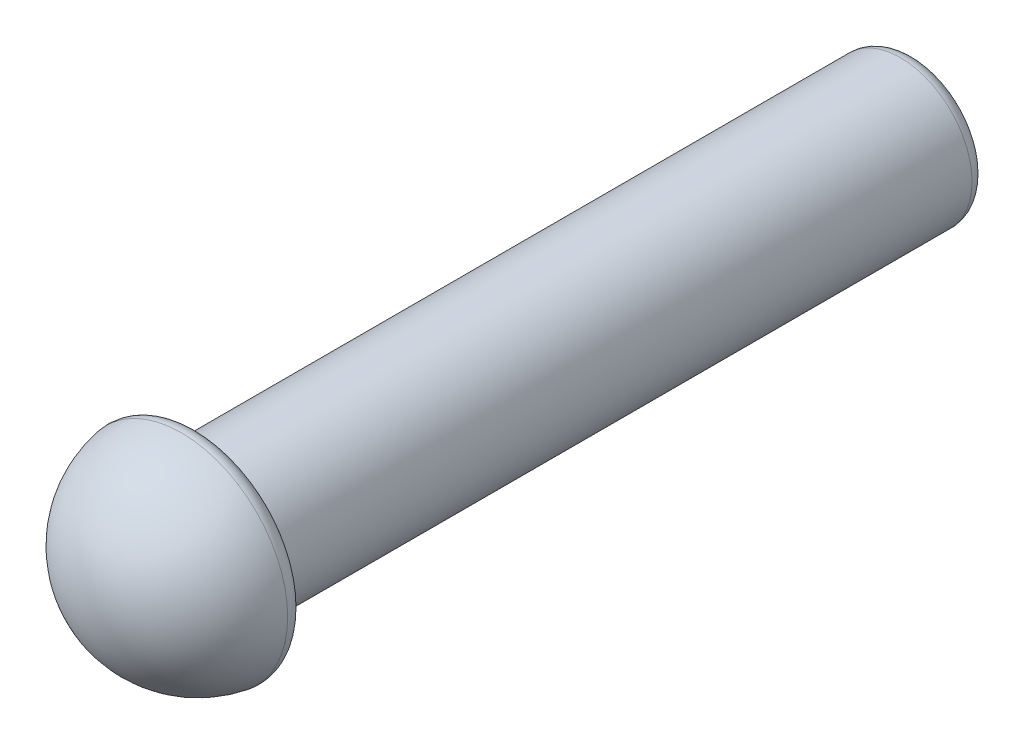
ISO-10303-21;
HEADER;
FILE_DESCRIPTION(('STEP AP214'),'2;1');
FILE_NAME('part.step','',(''),(''),'','','');
FILE_SCHEMA(('AUTOMOTIVE_DESIGN { 1 0 10303 214 1 1 1 1 }'));
ENDSEC;
DATA;
#1=APPLICATION_CONTEXT('core data for automotive mechanical design processes');
#2=APPLICATION_PROTOCOL_DEFINITION('international standard','automotive_design',2000,#1);
#3=PRODUCT_CONTEXT('',#1,'mechanical');
#4=PRODUCT('Part','Part','',(#3));
#5=PRODUCT_RELATED_PRODUCT_CATEGORY('part','',(#4));
#6=PRODUCT_DEFINITION_FORMATION('','',#4);
#7=PRODUCT_DEFINITION_CONTEXT('part definition',#1,'design');
#8=PRODUCT_DEFINITION('design','',#6,#7);
#9=PRODUCT_DEFINITION_SHAPE('','',#8);
#10=(LENGTH_UNIT() NAMED_UNIT(*) SI_UNIT(.MILLI.,.METRE.));
#11=(NAMED_UNIT(*) PLANE_ANGLE_UNIT() SI_UNIT($,.RADIAN.));
#12=(NAMED_UNIT(*) SI_UNIT($,.STERADIAN.) SOLID_ANGLE_UNIT());
#13=UNCERTAINTY_MEASURE_WITH_UNIT(LENGTH_MEASURE(1.E-05),#10,'distance_accuracy_value','');
#14=(GEOMETRIC_REPRESENTATION_CONTEXT(3) GLOBAL_UNCERTAINTY_ASSIGNED_CONTEXT((#13)) GLOBAL_UNIT_ASSIGNED_CONTEXT((#10,
#11,#12)) REPRESENTATION_CONTEXT('',''));
#15=CARTESIAN_POINT('',(0.,0.,0.));
#16=DIRECTION('',(0.,0.,1.));
#17=DIRECTION('',(1.,0.,0.));
#18=AXIS2_PLACEMENT_3D('',#15,#16,#17);
#19=CARTESIAN_POINT('',(0.,0.,-25.4));
#20=DIRECTION('',(0.,0.,1.));
#21=DIRECTION('',(1.,0.,0.));
#22=AXIS2_PLACEMENT_3D('',#19,#20,#21);
#23=PLANE('',#22);
#24=CARTESIAN_POINT('',(0.,0.,-25.4));
#25=DIRECTION('',(0.,0.,1.));
#26=DIRECTION('',(1.,0.,0.));
#27=AXIS2_PLACEMENT_3D('',#24,#25,#26);
#28=CIRCLE('',#27,2.032);
#29=CARTESIAN_POINT('',(2.032,0.,-25.4));
#30=VERTEX_POINT('',#29);
#31=EDGE_CURVE('E55',#30,#30,#28,.F.);
#32=ORIENTED_EDGE('',*,*,#31,.T.);
#33=EDGE_LOOP('',(#32));
#34=FACE_BOUND('',#33,.T.);
#35=ADVANCED_FACE('F37',(#34),#23,.F.);
#36=CARTESIAN_POINT('',(0.,0.,3.30705037148499));
#37=DIRECTION('',(0.,0.,1.));
#38=DIRECTION('',(1.,0.,0.));
#39=AXIS2_PLACEMENT_3D('',#36,#37,#38);
#40=CYLINDRICAL_SURFACE('',#39,2.54);
#41=CARTESIAN_POINT('',(0.,0.,-24.892));
#42=DIRECTION('',(0.,0.,1.));
#43=DIRECTION('',(1.,0.,0.));
#44=AXIS2_PLACEMENT_3D('',#41,#42,#43);
#45=CIRCLE('',#44,2.54);
#46=CARTESIAN_POINT('',(2.54,0.,-24.892));
#47=VERTEX_POINT('',#46);
#48=EDGE_CURVE('E61',#47,#47,#45,.T.);
#49=ORIENTED_EDGE('',*,*,#48,.T.);
#50=EDGE_LOOP('',(#49));
#51=FACE_BOUND('',#50,.T.);
#52=CARTESIAN_POINT('',(0.,0.,-0.507999999999989));
#53=DIRECTION('',(0.,0.,1.));
#54=DIRECTION('',(1.,0.,0.));
#55=AXIS2_PLACEMENT_3D('',#52,#53,#54);
#56=CIRCLE('',#55,2.54);
#57=CARTESIAN_POINT('',(2.54,0.,-0.507999999999989));
#58=VERTEX_POINT('',#57);
#59=EDGE_CURVE('E65',#58,#58,#56,.F.);
#60=ORIENTED_EDGE('',*,*,#59,.T.);
#61=EDGE_LOOP('',(#60));
#62=FACE_BOUND('',#61,.T.);
#63=ADVANCED_FACE('F70',(#51,#62),#40,.T.);
#64=CARTESIAN_POINT('',(0.,2.54,0.));
#65=DIRECTION('',(0.,0.,1.));
#66=DIRECTION('',(1.,0.,0.));
#67=AXIS2_PLACEMENT_3D('',#64,#65,#66);
#68=PLANE('',#67);
#69=CARTESIAN_POINT('',(0.,0.,0.));
#70=DIRECTION('',(0.,0.,1.));
#71=DIRECTION('',(1.,0.,0.));
#72=AXIS2_PLACEMENT_3D('',#69,#70,#71);
#73=CIRCLE('',#72,3.048);
#74=CARTESIAN_POINT('',(3.048,0.,0.));
#75=VERTEX_POINT('',#74);
#76=EDGE_CURVE('E45',#75,#75,#73,.T.);
#77=ORIENTED_EDGE('',*,*,#76,.T.);
#78=EDGE_LOOP('',(#77));
#79=FACE_BOUND('',#78,.T.);
#80=CARTESIAN_POINT('',(0.,0.,0.));
#81=DIRECTION('',(0.,0.,1.));
#82=DIRECTION('',(1.,0.,0.));
#83=AXIS2_PLACEMENT_3D('',#80,#81,#82);
#84=CIRCLE('',#83,3.26268907498094);
#85=CARTESIAN_POINT('',(3.26268907498094,0.,0.));
#86=VERTEX_POINT('',#85);
#87=EDGE_CURVE('E50',#86,#86,#84,.F.);
#88=ORIENTED_EDGE('',*,*,#87,.T.);
#89=EDGE_LOOP('',(#88));
#90=FACE_BOUND('',#89,.T.);
#91=ADVANCED_FACE('F90',(#79,#90),#68,.F.);
#92=CARTESIAN_POINT('',(0.,0.,0.));
#93=DIRECTION('',(0.,0.,1.));
#94=DIRECTION('',(0.,1.,0.));
#95=AXIS2_PLACEMENT_3D('',#92,#93,#94);
#96=SPHERICAL_SURFACE('',#95,3.81);
#97=CARTESIAN_POINT('',(0.,0.,0.586153846153858));
#98=DIRECTION('',(0.,0.,-1.));
#99=DIRECTION('',(-1.,0.,0.));
#100=AXIS2_PLACEMENT_3D('',#97,#98,#99);
#101=CIRCLE('',#100,3.76464124036262);
#102=CARTESIAN_POINT('',(-3.76464124036262,0.,0.586153846153858));
#103=VERTEX_POINT('',#102);
#104=EDGE_CURVE('E10',#103,#103,#101,.F.);
#105=ORIENTED_EDGE('',*,*,#104,.T.);
#106=EDGE_LOOP('',(#105));
#107=FACE_BOUND('',#106,.T.);
#108=ADVANCED_FACE('F81',(#107),#96,.T.);
#109=CARTESIAN_POINT('',(0.,0.,-24.892));
#110=DIRECTION('',(0.,0.,1.));
#111=DIRECTION('',(1.,0.,0.));
#112=AXIS2_PLACEMENT_3D('',#109,#110,#111);
#113=TOROIDAL_SURFACE('',#112,2.032,0.508);
#114=ORIENTED_EDGE('',*,*,#31,.F.);
#115=EDGE_LOOP('',(#114));
#116=FACE_BOUND('',#115,.T.);
#117=ORIENTED_EDGE('',*,*,#48,.F.);
#118=EDGE_LOOP('',(#117));
#119=FACE_BOUND('',#118,.T.);
#120=ADVANCED_FACE('F75',(#116,#119),#113,.T.);
#121=CARTESIAN_POINT('',(0.,0.,-0.507999999999989));
#122=DIRECTION('',(0.,0.,1.));
#123=DIRECTION('',(1.,0.,0.));
#124=AXIS2_PLACEMENT_3D('',#121,#122,#123);
#125=TOROIDAL_SURFACE('',#124,3.048,0.508);
#126=ORIENTED_EDGE('',*,*,#59,.F.);
#127=EDGE_LOOP('',(#126));
#128=FACE_BOUND('',#127,.T.);
#129=ORIENTED_EDGE('',*,*,#76,.F.);
#130=EDGE_LOOP('',(#129));
#131=FACE_BOUND('',#130,.T.);
#132=ADVANCED_FACE('F72',(#128,#131),#125,.F.);
#133=CARTESIAN_POINT('',(0.,0.,0.508000000000011));
#134=DIRECTION('',(0.,0.,1.));
#135=DIRECTION('',(1.,0.,0.));
#136=AXIS2_PLACEMENT_3D('',#133,#134,#135);
#137=TOROIDAL_SURFACE('',#136,3.26268907498094,0.508);
#138=ORIENTED_EDGE('',*,*,#87,.F.);
#139=EDGE_LOOP('',(#138));
#140=FACE_BOUND('',#139,.T.);
#141=ORIENTED_EDGE('',*,*,#104,.F.);
#142=EDGE_LOOP('',(#141));
#143=FACE_BOUND('',#142,.T.);
#144=ADVANCED_FACE('F39',(#140,#143),#137,.T.);
#145=CLOSED_SHELL('',(#35,#63,#91,#108,#120,#132,#144));
#146=MANIFOLD_SOLID_BREP('B2',#145);
#147=ADVANCED_BREP_SHAPE_REPRESENTATION('',(#18,#146),#14);
#148=SHAPE_DEFINITION_REPRESENTATION(#9,#147);
ENDSEC;
END-ISO-10303-21;
